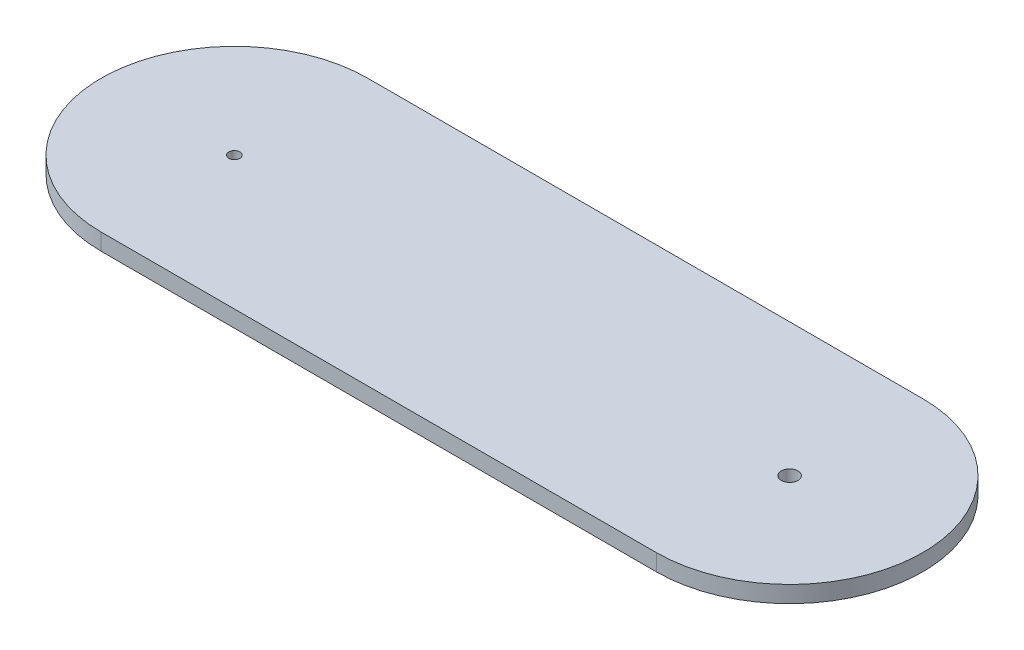
ISO-10303-21;
HEADER;
FILE_DESCRIPTION(('STEP AP214'),'2;1');
FILE_NAME('part.step','',(''),(''),'','','');
FILE_SCHEMA(('AUTOMOTIVE_DESIGN { 1 0 10303 214 1 1 1 1 }'));
ENDSEC;
DATA;
#1=APPLICATION_CONTEXT('core data for automotive mechanical design processes');
#2=APPLICATION_PROTOCOL_DEFINITION('international standard','automotive_design',2000,#1);
#3=PRODUCT_CONTEXT('',#1,'mechanical');
#4=PRODUCT('Part','Part','',(#3));
#5=PRODUCT_RELATED_PRODUCT_CATEGORY('part','',(#4));
#6=PRODUCT_DEFINITION_FORMATION('','',#4);
#7=PRODUCT_DEFINITION_CONTEXT('part definition',#1,'design');
#8=PRODUCT_DEFINITION('design','',#6,#7);
#9=PRODUCT_DEFINITION_SHAPE('','',#8);
#10=(LENGTH_UNIT() NAMED_UNIT(*) SI_UNIT(.MILLI.,.METRE.));
#11=(NAMED_UNIT(*) PLANE_ANGLE_UNIT() SI_UNIT($,.RADIAN.));
#12=(NAMED_UNIT(*) SI_UNIT($,.STERADIAN.) SOLID_ANGLE_UNIT());
#13=UNCERTAINTY_MEASURE_WITH_UNIT(LENGTH_MEASURE(1.E-05),#10,'distance_accuracy_value','');
#14=(GEOMETRIC_REPRESENTATION_CONTEXT(3) GLOBAL_UNCERTAINTY_ASSIGNED_CONTEXT((#13)) GLOBAL_UNIT_ASSIGNED_CONTEXT((#10,
#11,#12)) REPRESENTATION_CONTEXT('',''));
#15=CARTESIAN_POINT('',(0.,0.,0.));
#16=DIRECTION('',(0.,0.,1.));
#17=DIRECTION('',(1.,0.,0.));
#18=AXIS2_PLACEMENT_3D('',#15,#16,#17);
#19=CARTESIAN_POINT('',(0.,3.,0.));
#20=DIRECTION('',(0.,-1.,0.));
#21=DIRECTION('',(0.,0.,-1.));
#22=AXIS2_PLACEMENT_3D('',#19,#20,#21);
#23=CYLINDRICAL_SURFACE('',#22,24.);
#24=CARTESIAN_POINT('',(0.,0.,0.));
#25=DIRECTION('',(0.,1.,0.));
#26=DIRECTION('',(0.,0.,1.));
#27=AXIS2_PLACEMENT_3D('',#24,#25,#26);
#28=CIRCLE('',#27,24.);
#29=CARTESIAN_POINT('',(0.,0.,-24.));
#30=VERTEX_POINT('',#29);
#31=CARTESIAN_POINT('',(0.,0.,24.));
#32=VERTEX_POINT('',#31);
#33=EDGE_CURVE('E98',#30,#32,#28,.T.);
#34=ORIENTED_EDGE('',*,*,#33,.T.);
#35=DIRECTION('',(0.,-1.,0.));
#36=VECTOR('',#35,1.);
#37=CARTESIAN_POINT('',(0.,3.,24.));
#38=LINE('',#37,#36);
#39=CARTESIAN_POINT('',(0.,3.,24.));
#40=VERTEX_POINT('',#39);
#41=EDGE_CURVE('E11',#40,#32,#38,.T.);
#42=ORIENTED_EDGE('',*,*,#41,.F.);
#43=CARTESIAN_POINT('',(0.,3.,0.));
#44=DIRECTION('',(0.,1.,0.));
#45=DIRECTION('',(0.,0.,1.));
#46=AXIS2_PLACEMENT_3D('',#43,#44,#45);
#47=CIRCLE('',#46,24.);
#48=CARTESIAN_POINT('',(0.,3.,-24.));
#49=VERTEX_POINT('',#48);
#50=EDGE_CURVE('E85',#49,#40,#47,.T.);
#51=ORIENTED_EDGE('',*,*,#50,.F.);
#52=DIRECTION('',(0.,-1.,0.));
#53=VECTOR('',#52,1.);
#54=CARTESIAN_POINT('',(0.,3.,-24.));
#55=LINE('',#54,#53);
#56=EDGE_CURVE('E94',#49,#30,#55,.T.);
#57=ORIENTED_EDGE('',*,*,#56,.T.);
#58=EDGE_LOOP('',(#34,#42,#51,#57));
#59=FACE_BOUND('',#58,.T.);
#60=ADVANCED_FACE('F33',(#59),#23,.T.);
#61=CARTESIAN_POINT('',(100.,3.,24.));
#62=DIRECTION('',(0.,0.,-1.));
#63=DIRECTION('',(-1.,0.,0.));
#64=AXIS2_PLACEMENT_3D('',#61,#62,#63);
#65=PLANE('',#64);
#66=DIRECTION('',(1.,0.,0.));
#67=VECTOR('',#66,1.);
#68=CARTESIAN_POINT('',(100.,0.,24.));
#69=LINE('',#68,#67);
#70=CARTESIAN_POINT('',(100.,0.,24.));
#71=VERTEX_POINT('',#70);
#72=EDGE_CURVE('E89',#32,#71,#69,.T.);
#73=ORIENTED_EDGE('',*,*,#72,.T.);
#74=DIRECTION('',(0.,-1.,0.));
#75=VECTOR('',#74,1.);
#76=CARTESIAN_POINT('',(100.,3.,24.));
#77=LINE('',#76,#75);
#78=CARTESIAN_POINT('',(100.,3.,24.));
#79=VERTEX_POINT('',#78);
#80=EDGE_CURVE('E42',#79,#71,#77,.T.);
#81=ORIENTED_EDGE('',*,*,#80,.F.);
#82=DIRECTION('',(1.,0.,0.));
#83=VECTOR('',#82,1.);
#84=CARTESIAN_POINT('',(100.,3.,24.));
#85=LINE('',#84,#83);
#86=EDGE_CURVE('E80',#40,#79,#85,.T.);
#87=ORIENTED_EDGE('',*,*,#86,.F.);
#88=ORIENTED_EDGE('',*,*,#41,.T.);
#89=EDGE_LOOP('',(#73,#81,#87,#88));
#90=FACE_BOUND('',#89,.T.);
#91=ADVANCED_FACE('F88',(#90),#65,.F.);
#92=CARTESIAN_POINT('',(100.,3.,0.));
#93=DIRECTION('',(0.,-1.,0.));
#94=DIRECTION('',(0.,0.,-1.));
#95=AXIS2_PLACEMENT_3D('',#92,#93,#94);
#96=CYLINDRICAL_SURFACE('',#95,24.);
#97=CARTESIAN_POINT('',(100.,0.,0.));
#98=DIRECTION('',(0.,1.,0.));
#99=DIRECTION('',(0.,0.,-1.));
#100=AXIS2_PLACEMENT_3D('',#97,#98,#99);
#101=CIRCLE('',#100,24.);
#102=CARTESIAN_POINT('',(100.,0.,-24.));
#103=VERTEX_POINT('',#102);
#104=EDGE_CURVE('E67',#71,#103,#101,.T.);
#105=ORIENTED_EDGE('',*,*,#104,.T.);
#106=DIRECTION('',(0.,-1.,0.));
#107=VECTOR('',#106,1.);
#108=CARTESIAN_POINT('',(100.,3.,-24.));
#109=LINE('',#108,#107);
#110=CARTESIAN_POINT('',(100.,3.,-24.));
#111=VERTEX_POINT('',#110);
#112=EDGE_CURVE('E90',#111,#103,#109,.T.);
#113=ORIENTED_EDGE('',*,*,#112,.F.);
#114=CARTESIAN_POINT('',(100.,3.,0.));
#115=DIRECTION('',(0.,1.,0.));
#116=DIRECTION('',(0.,0.,-1.));
#117=AXIS2_PLACEMENT_3D('',#114,#115,#116);
#118=CIRCLE('',#117,24.);
#119=EDGE_CURVE('E83',#79,#111,#118,.T.);
#120=ORIENTED_EDGE('',*,*,#119,.F.);
#121=ORIENTED_EDGE('',*,*,#80,.T.);
#122=EDGE_LOOP('',(#105,#113,#120,#121));
#123=FACE_BOUND('',#122,.T.);
#124=ADVANCED_FACE('F92',(#123),#96,.T.);
#125=CARTESIAN_POINT('',(0.,3.,-24.));
#126=DIRECTION('',(0.,0.,1.));
#127=DIRECTION('',(1.,0.,0.));
#128=AXIS2_PLACEMENT_3D('',#125,#126,#127);
#129=PLANE('',#128);
#130=DIRECTION('',(-1.,0.,0.));
#131=VECTOR('',#130,1.);
#132=CARTESIAN_POINT('',(0.,0.,-24.));
#133=LINE('',#132,#131);
#134=EDGE_CURVE('E73',#103,#30,#133,.T.);
#135=ORIENTED_EDGE('',*,*,#134,.T.);
#136=ORIENTED_EDGE('',*,*,#56,.F.);
#137=DIRECTION('',(-1.,0.,0.));
#138=VECTOR('',#137,1.);
#139=CARTESIAN_POINT('',(0.,3.,-24.));
#140=LINE('',#139,#138);
#141=EDGE_CURVE('E50',#111,#49,#140,.T.);
#142=ORIENTED_EDGE('',*,*,#141,.F.);
#143=ORIENTED_EDGE('',*,*,#112,.T.);
#144=EDGE_LOOP('',(#135,#136,#142,#143));
#145=FACE_BOUND('',#144,.T.);
#146=ADVANCED_FACE('F106',(#145),#129,.F.);
#147=CARTESIAN_POINT('',(0.,3.,0.));
#148=DIRECTION('',(0.,1.,0.));
#149=DIRECTION('',(0.,0.,1.));
#150=AXIS2_PLACEMENT_3D('',#147,#148,#149);
#151=PLANE('',#150);
#152=CARTESIAN_POINT('',(100.,3.,0.));
#153=DIRECTION('',(0.,1.,0.));
#154=DIRECTION('',(0.,0.,1.));
#155=AXIS2_PLACEMENT_3D('',#152,#153,#154);
#156=CIRCLE('',#155,1.5);
#157=CARTESIAN_POINT('',(100.,3.,1.49999999999999));
#158=VERTEX_POINT('',#157);
#159=EDGE_CURVE('E117',#158,#158,#156,.T.);
#160=ORIENTED_EDGE('',*,*,#159,.F.);
#161=EDGE_LOOP('',(#160));
#162=FACE_BOUND('',#161,.T.);
#163=CARTESIAN_POINT('',(0.,3.,0.));
#164=DIRECTION('',(0.,1.,0.));
#165=DIRECTION('',(0.,0.,1.));
#166=AXIS2_PLACEMENT_3D('',#163,#164,#165);
#167=CIRCLE('',#166,1.);
#168=CARTESIAN_POINT('',(0.,3.,1.));
#169=VERTEX_POINT('',#168);
#170=EDGE_CURVE('E112',#169,#169,#167,.T.);
#171=ORIENTED_EDGE('',*,*,#170,.F.);
#172=EDGE_LOOP('',(#171));
#173=FACE_BOUND('',#172,.T.);
#174=ORIENTED_EDGE('',*,*,#50,.T.);
#175=ORIENTED_EDGE('',*,*,#86,.T.);
#176=ORIENTED_EDGE('',*,*,#119,.T.);
#177=ORIENTED_EDGE('',*,*,#141,.T.);
#178=EDGE_LOOP('',(#174,#175,#176,#177));
#179=FACE_BOUND('',#178,.T.);
#180=ADVANCED_FACE('F81',(#162,#173,#179),#151,.T.);
#181=CARTESIAN_POINT('',(0.,0.,0.));
#182=DIRECTION('',(0.,1.,0.));
#183=DIRECTION('',(0.,0.,1.));
#184=AXIS2_PLACEMENT_3D('',#181,#182,#183);
#185=PLANE('',#184);
#186=CARTESIAN_POINT('',(100.,0.,0.));
#187=DIRECTION('',(0.,1.,0.));
#188=DIRECTION('',(0.,0.,1.));
#189=AXIS2_PLACEMENT_3D('',#186,#187,#188);
#190=CIRCLE('',#189,1.5);
#191=CARTESIAN_POINT('',(100.,0.,1.49999999999999));
#192=VERTEX_POINT('',#191);
#193=EDGE_CURVE('E36',#192,#192,#190,.T.);
#194=ORIENTED_EDGE('',*,*,#193,.T.);
#195=EDGE_LOOP('',(#194));
#196=FACE_BOUND('',#195,.T.);
#197=CARTESIAN_POINT('',(0.,0.,0.));
#198=DIRECTION('',(0.,1.,0.));
#199=DIRECTION('',(0.,0.,1.));
#200=AXIS2_PLACEMENT_3D('',#197,#198,#199);
#201=CIRCLE('',#200,1.);
#202=CARTESIAN_POINT('',(0.,0.,1.));
#203=VERTEX_POINT('',#202);
#204=EDGE_CURVE('E101',#203,#203,#201,.T.);
#205=ORIENTED_EDGE('',*,*,#204,.T.);
#206=EDGE_LOOP('',(#205));
#207=FACE_BOUND('',#206,.T.);
#208=ORIENTED_EDGE('',*,*,#33,.F.);
#209=ORIENTED_EDGE('',*,*,#134,.F.);
#210=ORIENTED_EDGE('',*,*,#104,.F.);
#211=ORIENTED_EDGE('',*,*,#72,.F.);
#212=EDGE_LOOP('',(#208,#209,#210,#211));
#213=FACE_BOUND('',#212,.T.);
#214=ADVANCED_FACE('F109',(#196,#207,#213),#185,.F.);
#215=CARTESIAN_POINT('',(0.,0.,0.));
#216=DIRECTION('',(0.,1.,0.));
#217=DIRECTION('',(0.,0.,1.));
#218=AXIS2_PLACEMENT_3D('',#215,#216,#217);
#219=CYLINDRICAL_SURFACE('',#218,1.);
#220=ORIENTED_EDGE('',*,*,#204,.F.);
#221=EDGE_LOOP('',(#220));
#222=FACE_BOUND('',#221,.T.);
#223=ORIENTED_EDGE('',*,*,#170,.T.);
#224=EDGE_LOOP('',(#223));
#225=FACE_BOUND('',#224,.T.);
#226=ADVANCED_FACE('F128',(#222,#225),#219,.F.);
#227=CARTESIAN_POINT('',(100.,-7.,0.));
#228=DIRECTION('',(0.,1.,0.));
#229=DIRECTION('',(0.,0.,1.));
#230=AXIS2_PLACEMENT_3D('',#227,#228,#229);
#231=CYLINDRICAL_SURFACE('',#230,1.5);
#232=ORIENTED_EDGE('',*,*,#159,.T.);
#233=EDGE_LOOP('',(#232));
#234=FACE_BOUND('',#233,.T.);
#235=ORIENTED_EDGE('',*,*,#193,.F.);
#236=EDGE_LOOP('',(#235));
#237=FACE_BOUND('',#236,.T.);
#238=ADVANCED_FACE('F126',(#234,#237),#231,.F.);
#239=CLOSED_SHELL('',(#60,#91,#124,#146,#180,#214,#226,#238));
#240=MANIFOLD_SOLID_BREP('B2',#239);
#241=ADVANCED_BREP_SHAPE_REPRESENTATION('',(#18,#240),#14);
#242=SHAPE_DEFINITION_REPRESENTATION(#9,#241);
ENDSEC;
END-ISO-10303-21;
